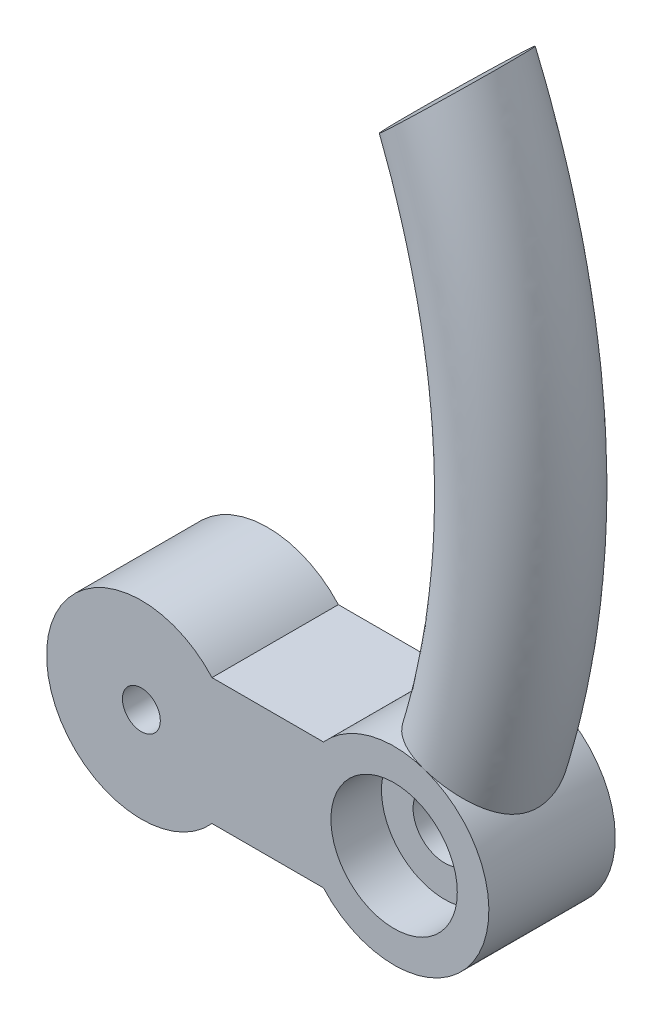
ISO-10303-21;
HEADER;
FILE_DESCRIPTION(('STEP AP214'),'2;1');
FILE_NAME('part.step','',(''),(''),'','','');
FILE_SCHEMA(('AUTOMOTIVE_DESIGN { 1 0 10303 214 1 1 1 1 }'));
ENDSEC;
DATA;
#1=APPLICATION_CONTEXT('core data for automotive mechanical design processes');
#2=APPLICATION_PROTOCOL_DEFINITION('international standard','automotive_design',2000,#1);
#3=PRODUCT_CONTEXT('',#1,'mechanical');
#4=PRODUCT('Part','Part','',(#3));
#5=PRODUCT_RELATED_PRODUCT_CATEGORY('part','',(#4));
#6=PRODUCT_DEFINITION_FORMATION('','',#4);
#7=PRODUCT_DEFINITION_CONTEXT('part definition',#1,'design');
#8=PRODUCT_DEFINITION('design','',#6,#7);
#9=PRODUCT_DEFINITION_SHAPE('','',#8);
#10=(LENGTH_UNIT() NAMED_UNIT(*) SI_UNIT(.MILLI.,.METRE.));
#11=(NAMED_UNIT(*) PLANE_ANGLE_UNIT() SI_UNIT($,.RADIAN.));
#12=(NAMED_UNIT(*) SI_UNIT($,.STERADIAN.) SOLID_ANGLE_UNIT());
#13=UNCERTAINTY_MEASURE_WITH_UNIT(LENGTH_MEASURE(1.E-05),#10,'distance_accuracy_value','');
#14=(GEOMETRIC_REPRESENTATION_CONTEXT(3) GLOBAL_UNCERTAINTY_ASSIGNED_CONTEXT((#13)) GLOBAL_UNIT_ASSIGNED_CONTEXT((#10,
#11,#12)) REPRESENTATION_CONTEXT('',''));
#15=CARTESIAN_POINT('',(0.,0.,0.));
#16=DIRECTION('',(0.,0.,1.));
#17=DIRECTION('',(1.,0.,0.));
#18=AXIS2_PLACEMENT_3D('',#15,#16,#17);
#19=CARTESIAN_POINT('',(10.,0.,5.));
#20=DIRECTION('',(0.,0.,-1.));
#21=DIRECTION('',(-1.,0.,0.));
#22=AXIS2_PLACEMENT_3D('',#19,#20,#21);
#23=CYLINDRICAL_SURFACE('',#22,2.5);
#24=CARTESIAN_POINT('',(10.,0.,1.));
#25=DIRECTION('',(0.,0.,1.));
#26=DIRECTION('',(1.,0.,0.));
#27=AXIS2_PLACEMENT_3D('',#24,#25,#26);
#28=CIRCLE('',#27,2.5);
#29=CARTESIAN_POINT('',(12.5,0.,1.));
#30=VERTEX_POINT('',#29);
#31=EDGE_CURVE('E98',#30,#30,#28,.T.);
#32=ORIENTED_EDGE('',*,*,#31,.T.);
#33=EDGE_LOOP('',(#32));
#34=FACE_BOUND('',#33,.T.);
#35=CARTESIAN_POINT('',(10.,0.,-5.));
#36=DIRECTION('',(0.,0.,1.));
#37=DIRECTION('',(1.,0.,0.));
#38=AXIS2_PLACEMENT_3D('',#35,#36,#37);
#39=CIRCLE('',#38,2.5);
#40=CARTESIAN_POINT('',(12.5,0.,-5.));
#41=VERTEX_POINT('',#40);
#42=EDGE_CURVE('E197',#41,#41,#39,.T.);
#43=ORIENTED_EDGE('',*,*,#42,.F.);
#44=EDGE_LOOP('',(#43));
#45=FACE_BOUND('',#44,.T.);
#46=ADVANCED_FACE('F35',(#34,#45),#23,.F.);
#47=CARTESIAN_POINT('',(10.,0.,5.));
#48=DIRECTION('',(0.,0.,-1.));
#49=DIRECTION('',(-1.,0.,0.));
#50=AXIS2_PLACEMENT_3D('',#47,#48,#49);
#51=CYLINDRICAL_SURFACE('',#50,7.5);
#52=CARTESIAN_POINT('',(10.,0.,5.));
#53=DIRECTION('',(0.,0.,1.));
#54=DIRECTION('',(1.,0.,0.));
#55=AXIS2_PLACEMENT_3D('',#52,#53,#54);
#56=CIRCLE('',#55,7.5);
#57=CARTESIAN_POINT('',(12.4349265316413,7.09373898487314,5.));
#58=VERTEX_POINT('',#57);
#59=CARTESIAN_POINT('',(4.40983005625052,5.,5.));
#60=VERTEX_POINT('',#59);
#61=EDGE_CURVE('E59',#58,#60,#56,.T.);
#62=ORIENTED_EDGE('',*,*,#61,.F.);
#63=CARTESIAN_POINT('',(12.4349265316413,7.09373898487314,5.));
#64=CARTESIAN_POINT('',(12.3317778963688,7.12914563765134,5.00000098680929));
#65=CARTESIAN_POINT('',(12.2278646702754,7.16229336303019,4.99586441202673));
#66=CARTESIAN_POINT('',(12.0193158731499,7.22386169777516,4.97931245522058));
#67=CARTESIAN_POINT('',(11.9146804416663,7.25228319513128,4.96689863057347));
#68=CARTESIAN_POINT('',(11.7065883444993,7.30403548695182,4.93408403200781));
#69=CARTESIAN_POINT('',(11.6031307098904,7.32741602792738,4.91376744019318));
#70=CARTESIAN_POINT('',(11.3970473377822,7.36948608393121,4.86536837955253));
#71=CARTESIAN_POINT('',(11.2944219167641,7.38817388852059,4.83728308695585));
#72=CARTESIAN_POINT('',(11.0906248659098,7.42099731905275,4.7736271704088));
#73=CARTESIAN_POINT('',(10.989455368368,7.4351268116804,4.73804656680214));
#74=CARTESIAN_POINT('',(10.7893451949434,7.45902870554867,4.6598149907221));
#75=CARTESIAN_POINT('',(10.6904054187591,7.46879937685718,4.61716122024123));
#76=CARTESIAN_POINT('',(10.3931743238323,7.49235869304758,4.47702474098137));
#77=CARTESIAN_POINT('',(10.1992714062767,7.49965096267358,4.36887784475125));
#78=CARTESIAN_POINT('',(9.82725839304931,7.50032557673154,4.12857820091443));
#79=CARTESIAN_POINT('',(9.64914912312472,7.49370719431229,3.9964241992322));
#80=CARTESIAN_POINT('',(9.28344452216033,7.46829134297541,3.68805037676362));
#81=CARTESIAN_POINT('',(9.09906534483846,7.44767831394053,3.5081584679261));
#82=CARTESIAN_POINT('',(8.75806277512366,7.39846934315223,3.12456933600828));
#83=CARTESIAN_POINT('',(8.6014729083037,7.36986386477454,2.92084384445084));
#84=CARTESIAN_POINT('',(8.29792271502172,7.30619597797985,2.46052888922173));
#85=CARTESIAN_POINT('',(8.15599034891167,7.27081094066926,2.20060264306369));
#86=CARTESIAN_POINT('',(7.97845258285973,7.22267908396678,1.79505423253641));
#87=CARTESIAN_POINT('',(7.92516122144771,7.20745742052265,1.65723880062476));
#88=CARTESIAN_POINT('',(7.831062683346,7.17970228711716,1.37709974967265));
#89=CARTESIAN_POINT('',(7.79025423658329,7.16716854371245,1.23477659089758));
#90=CARTESIAN_POINT('',(7.72301335989177,7.14608522998117,0.95153044134504));
#91=CARTESIAN_POINT('',(7.6961462172236,7.13741654933422,0.810719509299193));
#92=CARTESIAN_POINT('',(7.65529551523209,7.12410181442867,0.52704177001832));
#93=CARTESIAN_POINT('',(7.64131154642693,7.11945563231831,0.384175028272228));
#94=CARTESIAN_POINT('',(7.62653640252817,7.1145436990205,0.097781695334699));
#95=CARTESIAN_POINT('',(7.62573623132552,7.11427496083754,-0.0457443790559346));
#96=CARTESIAN_POINT('',(7.63732435186421,7.11813189745734,-0.332195481432792));
#97=CARTESIAN_POINT('',(7.6497116997383,7.12225725776231,-0.475120551699542));
#98=CARTESIAN_POINT('',(7.68514359763364,7.13384434964348,-0.742077679641409));
#99=CARTESIAN_POINT('',(7.70673710062002,7.14084827785249,-0.866325754691601));
#100=CARTESIAN_POINT('',(7.7596029767183,7.15761065001372,-1.11259266553468));
#101=CARTESIAN_POINT('',(7.79087854168982,7.16737000224577,-1.234610752104));
#102=CARTESIAN_POINT('',(7.86268603765668,7.18910934102857,-1.47569272323675));
#103=CARTESIAN_POINT('',(7.90321829912826,7.20108940685885,-1.59475650215922));
#104=CARTESIAN_POINT('',(7.99306402323044,7.22664434526931,-1.82935517155476));
#105=CARTESIAN_POINT('',(8.0423810382321,7.24021986225824,-1.94488861220748));
#106=CARTESIAN_POINT('',(8.20984708951506,7.28417763443192,-2.30034331800013));
#107=CARTESIAN_POINT('',(8.34281234303576,7.31621983277671,-2.53332681813883));
#108=CARTESIAN_POINT('',(8.56733136111166,7.36228898937003,-2.8658368413514));
#109=CARTESIAN_POINT('',(8.646425561724,7.37732465474199,-2.97392854050432));
#110=CARTESIAN_POINT('',(8.81255879403477,7.40588336996587,-3.18403777436348));
#111=CARTESIAN_POINT('',(8.89959873811427,7.41940624571187,-3.28605460928713));
#112=CARTESIAN_POINT('',(9.19330901998269,7.45929040818104,-3.60528620032513));
#113=CARTESIAN_POINT('',(9.4152855551343,7.48095037116863,-3.80962839217299));
#114=CARTESIAN_POINT('',(9.7718713492736,7.49747811675257,-4.08555198042914));
#115=CARTESIAN_POINT('',(9.89464923880205,7.50032779392262,-4.17241712444949));
#116=CARTESIAN_POINT('',(10.1473875853727,7.49961330394543,-4.33503714223072));
#117=CARTESIAN_POINT('',(10.2773452549728,7.49605160919043,-4.41079628657185));
#118=CARTESIAN_POINT('',(10.5092984346633,7.48334550947216,-4.53221537923103));
#119=CARTESIAN_POINT('',(10.6099601035044,7.47585893657875,-4.58062132668945));
#120=CARTESIAN_POINT('',(10.8140521355954,7.45639438123575,-4.67012760351928));
#121=CARTESIAN_POINT('',(10.9174818473642,7.44441744714447,-4.71122963482679));
#122=CARTESIAN_POINT('',(11.126383576021,7.41568397028855,-4.78564665949512));
#123=CARTESIAN_POINT('',(11.2318541581707,7.39893067912012,-4.81896692246576));
#124=CARTESIAN_POINT('',(11.4441494088197,7.36043939244542,-4.87745499068337));
#125=CARTESIAN_POINT('',(11.5509741121938,7.33870126830952,-4.90262258551682));
#126=CARTESIAN_POINT('',(11.7655533226274,7.29005964797167,-4.94457229465953));
#127=CARTESIAN_POINT('',(11.8733098313271,7.26313632658783,-4.96132130412687));
#128=CARTESIAN_POINT('',(12.0884430479151,7.2042239759634,-4.98609141324855));
#129=CARTESIAN_POINT('',(12.195819756352,7.1722349540417,-4.9941125255128));
#130=CARTESIAN_POINT('',(12.4093004832417,7.10336897640207,-5.00137448020193));
#131=CARTESIAN_POINT('',(12.5154044332481,7.06649175908071,-5.00061485251688));
#132=CARTESIAN_POINT('',(12.7254754105862,6.98815795062078,-4.99040857802072));
#133=CARTESIAN_POINT('',(12.8294424996984,6.94670149209797,-4.98096218272217));
#134=CARTESIAN_POINT('',(13.0283360692809,6.86222586832962,-4.95442875294238));
#135=CARTESIAN_POINT('',(13.1234312993242,6.81944857255555,-4.93783263752232));
#136=CARTESIAN_POINT('',(13.3105253568169,6.73061422289876,-4.89744640646084));
#137=CARTESIAN_POINT('',(13.4025231155855,6.68455605379355,-4.87365383561957));
#138=CARTESIAN_POINT('',(13.6731114972175,6.5421462876278,-4.79198102496482));
#139=CARTESIAN_POINT('',(13.8464403403268,6.44149799499257,-4.72378587892657));
#140=CARTESIAN_POINT('',(14.1893249124643,6.22446940647486,-4.55670900485077));
#141=CARTESIAN_POINT('',(14.3574978124181,6.10747444570931,-4.45582672234746));
#142=CARTESIAN_POINT('',(14.6731589676551,5.86947166535845,-4.2295297935602));
#143=CARTESIAN_POINT('',(14.8206386150957,5.74846220157312,-4.1041049898818));
#144=CARTESIAN_POINT('',(15.1191501256542,5.48548870105786,-3.80770709532122));
#145=CARTESIAN_POINT('',(15.2661546570681,5.34362288851883,-3.63260061843145));
#146=CARTESIAN_POINT('',(15.5322137718051,5.06768055139388,-3.25632280042235));
#147=CARTESIAN_POINT('',(15.651224858675,4.93361638914295,-3.05511164042766));
#148=CARTESIAN_POINT('',(15.8171141238895,4.73499291242648,-2.72003709015011));
#149=CARTESIAN_POINT('',(15.8731837044403,4.66506139899429,-2.59378262111564));
#150=CARTESIAN_POINT('',(15.9763522542466,4.53213912961981,-2.33406859513803));
#151=CARTESIAN_POINT('',(16.0234495916377,4.46914963716324,-2.20060773315624));
#152=CARTESIAN_POINT('',(16.1085974977279,4.3520426527192,-1.92733869123475));
#153=CARTESIAN_POINT('',(16.1466628682438,4.29791069062214,-1.7875413499087));
#154=CARTESIAN_POINT('',(16.2137853257329,4.20028443786103,-1.50219893042241));
#155=CARTESIAN_POINT('',(16.2428460540991,4.15678584866657,-1.35665620255696));
#156=CARTESIAN_POINT('',(16.2858874372761,4.09130227026317,-1.09695793788369));
#157=CARTESIAN_POINT('',(16.3018170143885,4.06665784855413,-0.983789191283092));
#158=CARTESIAN_POINT('',(16.3284079992512,4.02515382205104,-0.755430675234384));
#159=CARTESIAN_POINT('',(16.3390705360881,4.00829254884738,-0.640241344422812));
#160=CARTESIAN_POINT('',(16.3550735989555,3.98287161393357,-0.408682141254402));
#161=CARTESIAN_POINT('',(16.3604188051718,3.97430465194943,-0.29231339830014));
#162=CARTESIAN_POINT('',(16.3657752706186,3.96571955152868,-0.05913265058911));
#163=CARTESIAN_POINT('',(16.3657863950365,3.96570162915899,0.0576793652962453));
#164=CARTESIAN_POINT('',(16.360473674295,3.97421679911055,0.290881964953061));
#165=CARTESIAN_POINT('',(16.3551491593893,3.98275096491697,0.407272493977442));
#166=CARTESIAN_POINT('',(16.3391935582005,4.0080977366923,0.638773815842308));
#167=CARTESIAN_POINT('',(16.3285624268456,4.02491041297491,0.75388459780474));
#168=CARTESIAN_POINT('',(16.3020336923408,4.06632198215567,0.982145326115038));
#169=CARTESIAN_POINT('',(16.2861330626268,4.09092534931573,1.09529410618383));
#170=CARTESIAN_POINT('',(16.2491238474367,4.14723792893873,1.31895712875471));
#171=CARTESIAN_POINT('',(16.2280131330571,4.17895004563565,1.42947027401087));
#172=CARTESIAN_POINT('',(16.155687995092,4.28544196322094,1.76198964397616));
#173=CARTESIAN_POINT('',(16.0961619609967,4.37044266114733,1.97903047503992));
#174=CARTESIAN_POINT('',(15.9555842753328,4.56014593201688,2.39676442871497));
#175=CARTESIAN_POINT('',(15.8745187206832,4.66486121733584,2.59744688278668));
#176=CARTESIAN_POINT('',(15.6722508964742,4.90973652520259,3.01880585756089));
#177=CARTESIAN_POINT('',(15.5462731417343,5.05280435789534,3.2355249274641));
#178=CARTESIAN_POINT('',(15.2619680481482,5.34824954949672,3.6394044020338));
#179=CARTESIAN_POINT('',(15.1036397111783,5.50062719554253,3.82656389437245));
#180=CARTESIAN_POINT('',(14.770777011033,5.79080488959857,4.14990350239588));
#181=CARTESIAN_POINT('',(14.5993650086254,5.92856570229929,4.28928620911287));
#182=CARTESIAN_POINT('',(14.3223721011826,6.13027007257405,4.47367083165434));
#183=CARTESIAN_POINT('',(14.2266799045237,6.19671156811386,4.53103822812464));
#184=CARTESIAN_POINT('',(14.0288929138394,6.32708647659936,4.6368419581543));
#185=CARTESIAN_POINT('',(13.9268012404284,6.39102108764468,4.68528260000863));
#186=CARTESIAN_POINT('',(13.716076703262,6.51581497408457,4.77273419247333));
#187=CARTESIAN_POINT('',(13.6074139968484,6.57665748329362,4.81169734141867));
#188=CARTESIAN_POINT('',(13.3846932956662,6.69400322457248,4.87914571754643));
#189=CARTESIAN_POINT('',(13.270638420941,6.75050891755351,4.9076369223009));
#190=CARTESIAN_POINT('',(13.0381853459246,6.8582655589557,4.95348995348068));
#191=CARTESIAN_POINT('',(12.9197966060381,6.90952712277148,4.97087465220231));
#192=CARTESIAN_POINT('',(12.6796076586592,7.00617163434061,4.99412543225153));
#193=CARTESIAN_POINT('',(12.5578096662712,7.05155829611619,4.99999882439338));
#194=CARTESIAN_POINT('',(12.4349265316413,7.09373898487314,5.));
#195=B_SPLINE_CURVE_WITH_KNOTS('',3,(#63,#64,#65,#66,#67,#68,#69,#70,#71,#72,#73,#74,#75,#76,
#77,#78,#79,#80,#81,#82,#83,#84,#85,#86,#87,#88,#89,#90,#91,#92,#93,#94,#95,#96,#97,#98,#99,
#100,#101,#102,#103,#104,#105,#106,#107,#108,#109,#110,#111,#112,#113,#114,#115,#116,#117,#118,
#119,#120,#121,#122,#123,#124,#125,#126,#127,#128,#129,#130,#131,#132,#133,#134,#135,#136,#137,
#138,#139,#140,#141,#142,#143,#144,#145,#146,#147,#148,#149,#150,#151,#152,#153,#154,#155,#156,
#157,#158,#159,#160,#161,#162,#163,#164,#165,#166,#167,#168,#169,#170,#171,#172,#173,#174,#175,
#176,#177,#178,#179,#180,#181,#182,#183,#184,#185,#186,#187,#188,#189,#190,#191,#192,#193,#194),
.UNSPECIFIED.,.T.,.F.,(4,2,2,2,2,2,2,2,2,2,2,2,2,2,2,2,2,2,2,2,2,2,2,2,2,2,2,2,2,2,2,2,2,2,2,2,
2,2,2,2,2,2,2,2,2,2,2,2,2,2,2,2,2,2,2,2,2,2,2,2,2,2,2,2,2,4),(0.,0.327046116207848,
0.654030715575338,0.977623592438495,1.30133424388701,1.62547865634847,1.9497516012736,
2.61339027736956,3.27706363038542,4.04932735252893,4.82251650736526,5.71250468136559,
6.15763808016381,6.60272617382905,7.03294534327763,7.46315083806774,7.89306276524773,
8.32294392450952,8.70143481026504,9.08005060521917,9.45867991936907,9.8374626923429,
10.6441906260496,11.0482251215802,11.452306069431,12.3540746535529,12.8048191447997,
13.2553898544486,13.5909041911994,13.9263402446204,14.2615484865986,14.5967653793313,
14.9332903471695,15.2698148288019,15.6063573276213,15.9428900826552,16.2592894247472,
16.5757968341405,17.2083459575065,17.8909274881619,18.573792118114,19.3780234921301,
20.1834963526006,20.6475155050281,21.1116189724865,21.5749565193614,22.0381064515977,
22.3884791944535,22.738776795864,23.0887658002768,23.4387636502491,23.7888054385629,
24.1388502000158,24.4890963609692,24.8394858743752,25.5583425845343,26.2776644259788,
27.1399996186292,28.0023614212238,28.7799640070457,29.1691245652458,29.5580968092337,
29.9489920232699,30.3396637595551,30.729528346345,31.1191452503588),.UNSPECIFIED.);
#196=CARTESIAN_POINT('',(12.4349265284973,7.09373898595351,-5.));
#197=VERTEX_POINT('',#196);
#198=EDGE_CURVE('E50',#58,#197,#195,.T.);
#199=ORIENTED_EDGE('',*,*,#198,.T.);
#200=CARTESIAN_POINT('',(10.,0.,-5.));
#201=DIRECTION('',(0.,0.,1.));
#202=DIRECTION('',(1.,0.,0.));
#203=AXIS2_PLACEMENT_3D('',#200,#201,#202);
#204=CIRCLE('',#203,7.5);
#205=CARTESIAN_POINT('',(4.40983005625052,5.,-5.));
#206=VERTEX_POINT('',#205);
#207=EDGE_CURVE('E80',#197,#206,#204,.T.);
#208=ORIENTED_EDGE('',*,*,#207,.T.);
#209=DIRECTION('',(0.,0.,-1.));
#210=VECTOR('',#209,1.);
#211=CARTESIAN_POINT('',(4.40983005625052,5.,5.));
#212=LINE('',#211,#210);
#213=EDGE_CURVE('E189',#60,#206,#212,.T.);
#214=ORIENTED_EDGE('',*,*,#213,.F.);
#215=EDGE_LOOP('',(#62,#199,#208,#214));
#216=FACE_BOUND('',#215,.T.);
#217=ADVANCED_FACE('F151',(#216),#51,.T.);
#218=CARTESIAN_POINT('',(-10.,0.,5.));
#219=DIRECTION('',(0.,0.,-1.));
#220=DIRECTION('',(-1.,0.,0.));
#221=AXIS2_PLACEMENT_3D('',#218,#219,#220);
#222=CYLINDRICAL_SURFACE('',#221,1.5);
#223=CARTESIAN_POINT('',(-10.,0.,5.));
#224=DIRECTION('',(0.,0.,1.));
#225=DIRECTION('',(1.,0.,0.));
#226=AXIS2_PLACEMENT_3D('',#223,#224,#225);
#227=CIRCLE('',#226,1.5);
#228=CARTESIAN_POINT('',(-8.5,0.,5.));
#229=VERTEX_POINT('',#228);
#230=EDGE_CURVE('E188',#229,#229,#227,.T.);
#231=ORIENTED_EDGE('',*,*,#230,.T.);
#232=EDGE_LOOP('',(#231));
#233=FACE_BOUND('',#232,.T.);
#234=CARTESIAN_POINT('',(-10.,0.,-1.));
#235=DIRECTION('',(0.,0.,-1.));
#236=DIRECTION('',(-1.,0.,0.));
#237=AXIS2_PLACEMENT_3D('',#234,#235,#236);
#238=CIRCLE('',#237,1.5);
#239=CARTESIAN_POINT('',(-11.5,0.,-1.));
#240=VERTEX_POINT('',#239);
#241=EDGE_CURVE('E39',#240,#240,#238,.T.);
#242=ORIENTED_EDGE('',*,*,#241,.T.);
#243=EDGE_LOOP('',(#242));
#244=FACE_BOUND('',#243,.T.);
#245=ADVANCED_FACE('F37',(#233,#244),#222,.F.);
#246=CARTESIAN_POINT('',(0.,5.,5.));
#247=DIRECTION('',(0.,-1.,0.));
#248=DIRECTION('',(1.,0.,0.));
#249=AXIS2_PLACEMENT_3D('',#246,#247,#248);
#250=PLANE('',#249);
#251=DIRECTION('',(-1.,0.,0.));
#252=VECTOR('',#251,1.);
#253=CARTESIAN_POINT('',(0.,5.,-5.));
#254=LINE('',#253,#252);
#255=CARTESIAN_POINT('',(-4.40983005625053,5.,-5.));
#256=VERTEX_POINT('',#255);
#257=EDGE_CURVE('E183',#206,#256,#254,.T.);
#258=ORIENTED_EDGE('',*,*,#257,.T.);
#259=DIRECTION('',(0.,0.,-1.));
#260=VECTOR('',#259,1.);
#261=CARTESIAN_POINT('',(-4.40983005625053,5.,5.));
#262=LINE('',#261,#260);
#263=CARTESIAN_POINT('',(-4.40983005625053,5.,5.));
#264=VERTEX_POINT('',#263);
#265=EDGE_CURVE('E11',#264,#256,#262,.T.);
#266=ORIENTED_EDGE('',*,*,#265,.F.);
#267=DIRECTION('',(-1.,0.,0.));
#268=VECTOR('',#267,1.);
#269=CARTESIAN_POINT('',(0.,5.,5.));
#270=LINE('',#269,#268);
#271=EDGE_CURVE('E205',#60,#264,#270,.T.);
#272=ORIENTED_EDGE('',*,*,#271,.F.);
#273=ORIENTED_EDGE('',*,*,#213,.T.);
#274=EDGE_LOOP('',(#258,#266,#272,#273));
#275=FACE_BOUND('',#274,.T.);
#276=ADVANCED_FACE('F158',(#275),#250,.F.);
#277=CARTESIAN_POINT('',(-10.,0.,5.));
#278=DIRECTION('',(0.,0.,-1.));
#279=DIRECTION('',(-1.,0.,0.));
#280=AXIS2_PLACEMENT_3D('',#277,#278,#279);
#281=CYLINDRICAL_SURFACE('',#280,7.5);
#282=CARTESIAN_POINT('',(-10.,0.,-5.));
#283=DIRECTION('',(0.,0.,1.));
#284=DIRECTION('',(1.,0.,0.));
#285=AXIS2_PLACEMENT_3D('',#282,#283,#284);
#286=CIRCLE('',#285,7.5);
#287=CARTESIAN_POINT('',(-4.40983005625053,-5.,-5.));
#288=VERTEX_POINT('',#287);
#289=EDGE_CURVE('E179',#256,#288,#286,.T.);
#290=ORIENTED_EDGE('',*,*,#289,.T.);
#291=DIRECTION('',(0.,0.,-1.));
#292=VECTOR('',#291,1.);
#293=CARTESIAN_POINT('',(-4.40983005625053,-5.,5.));
#294=LINE('',#293,#292);
#295=CARTESIAN_POINT('',(-4.40983005625053,-5.,5.));
#296=VERTEX_POINT('',#295);
#297=EDGE_CURVE('E44',#296,#288,#294,.T.);
#298=ORIENTED_EDGE('',*,*,#297,.F.);
#299=CARTESIAN_POINT('',(-10.,0.,5.));
#300=DIRECTION('',(0.,0.,1.));
#301=DIRECTION('',(1.,0.,0.));
#302=AXIS2_PLACEMENT_3D('',#299,#300,#301);
#303=CIRCLE('',#302,7.5);
#304=EDGE_CURVE('E87',#264,#296,#303,.T.);
#305=ORIENTED_EDGE('',*,*,#304,.F.);
#306=ORIENTED_EDGE('',*,*,#265,.T.);
#307=EDGE_LOOP('',(#290,#298,#305,#306));
#308=FACE_BOUND('',#307,.T.);
#309=ADVANCED_FACE('F161',(#308),#281,.T.);
#310=CARTESIAN_POINT('',(0.,-5.,5.));
#311=DIRECTION('',(0.,-1.,0.));
#312=DIRECTION('',(1.,0.,0.));
#313=AXIS2_PLACEMENT_3D('',#310,#311,#312);
#314=PLANE('',#313);
#315=DIRECTION('',(-1.,0.,0.));
#316=VECTOR('',#315,1.);
#317=CARTESIAN_POINT('',(0.,-5.,-5.));
#318=LINE('',#317,#316);
#319=CARTESIAN_POINT('',(4.40983005625053,-5.,-5.));
#320=VERTEX_POINT('',#319);
#321=EDGE_CURVE('E173',#320,#288,#318,.T.);
#322=ORIENTED_EDGE('',*,*,#321,.F.);
#323=DIRECTION('',(0.,0.,-1.));
#324=VECTOR('',#323,1.);
#325=CARTESIAN_POINT('',(4.40983005625053,-5.,5.));
#326=LINE('',#325,#324);
#327=CARTESIAN_POINT('',(4.40983005625053,-5.,5.));
#328=VERTEX_POINT('',#327);
#329=EDGE_CURVE('E175',#328,#320,#326,.T.);
#330=ORIENTED_EDGE('',*,*,#329,.F.);
#331=DIRECTION('',(-1.,0.,0.));
#332=VECTOR('',#331,1.);
#333=CARTESIAN_POINT('',(0.,-5.,5.));
#334=LINE('',#333,#332);
#335=EDGE_CURVE('E202',#328,#296,#334,.T.);
#336=ORIENTED_EDGE('',*,*,#335,.T.);
#337=ORIENTED_EDGE('',*,*,#297,.T.);
#338=EDGE_LOOP('',(#322,#330,#336,#337));
#339=FACE_BOUND('',#338,.T.);
#340=ADVANCED_FACE('F164',(#339),#314,.T.);
#341=EDGE_CURVE('E181',#320,#197,#204,.T.);
#342=ORIENTED_EDGE('',*,*,#341,.T.);
#343=EDGE_CURVE('E97',#197,#58,#195,.T.);
#344=ORIENTED_EDGE('',*,*,#343,.T.);
#345=EDGE_CURVE('E191',#328,#58,#56,.T.);
#346=ORIENTED_EDGE('',*,*,#345,.F.);
#347=ORIENTED_EDGE('',*,*,#329,.T.);
#348=EDGE_LOOP('',(#342,#344,#346,#347));
#349=FACE_BOUND('',#348,.T.);
#350=ADVANCED_FACE('F113',(#349),#51,.T.);
#351=CARTESIAN_POINT('',(0.,0.,5.));
#352=DIRECTION('',(0.,0.,1.));
#353=DIRECTION('',(1.,0.,0.));
#354=AXIS2_PLACEMENT_3D('',#351,#352,#353);
#355=PLANE('',#354);
#356=CARTESIAN_POINT('',(10.,0.,5.));
#357=DIRECTION('',(0.,0.,1.));
#358=DIRECTION('',(1.,0.,0.));
#359=AXIS2_PLACEMENT_3D('',#356,#357,#358);
#360=CIRCLE('',#359,5.);
#361=CARTESIAN_POINT('',(15.,0.,5.));
#362=VERTEX_POINT('',#361);
#363=EDGE_CURVE('E314',#362,#362,#360,.T.);
#364=ORIENTED_EDGE('',*,*,#363,.F.);
#365=EDGE_LOOP('',(#364));
#366=FACE_BOUND('',#365,.T.);
#367=ORIENTED_EDGE('',*,*,#345,.T.);
#368=ORIENTED_EDGE('',*,*,#61,.T.);
#369=ORIENTED_EDGE('',*,*,#271,.T.);
#370=ORIENTED_EDGE('',*,*,#304,.T.);
#371=ORIENTED_EDGE('',*,*,#335,.F.);
#372=EDGE_LOOP('',(#367,#368,#369,#370,#371));
#373=FACE_BOUND('',#372,.T.);
#374=ORIENTED_EDGE('',*,*,#230,.F.);
#375=EDGE_LOOP('',(#374));
#376=FACE_BOUND('',#375,.T.);
#377=ADVANCED_FACE('F142',(#366,#373,#376),#355,.T.);
#378=CARTESIAN_POINT('',(0.,0.,-5.));
#379=DIRECTION('',(0.,0.,1.));
#380=DIRECTION('',(1.,0.,0.));
#381=AXIS2_PLACEMENT_3D('',#378,#379,#380);
#382=PLANE('',#381);
#383=ORIENTED_EDGE('',*,*,#207,.F.);
#384=ORIENTED_EDGE('',*,*,#341,.F.);
#385=ORIENTED_EDGE('',*,*,#321,.T.);
#386=ORIENTED_EDGE('',*,*,#289,.F.);
#387=ORIENTED_EDGE('',*,*,#257,.F.);
#388=EDGE_LOOP('',(#383,#384,#385,#386,#387));
#389=FACE_BOUND('',#388,.T.);
#390=CARTESIAN_POINT('',(-10.,0.,-5.));
#391=DIRECTION('',(0.,0.,-1.));
#392=DIRECTION('',(-1.,0.,0.));
#393=AXIS2_PLACEMENT_3D('',#390,#391,#392);
#394=CIRCLE('',#393,5.);
#395=CARTESIAN_POINT('',(-15.,0.,-5.));
#396=VERTEX_POINT('',#395);
#397=EDGE_CURVE('E208',#396,#396,#394,.T.);
#398=ORIENTED_EDGE('',*,*,#397,.F.);
#399=EDGE_LOOP('',(#398));
#400=FACE_BOUND('',#399,.T.);
#401=ORIENTED_EDGE('',*,*,#42,.T.);
#402=EDGE_LOOP('',(#401));
#403=FACE_BOUND('',#402,.T.);
#404=ADVANCED_FACE('F140',(#389,#400,#403),#382,.F.);
#405=CARTESIAN_POINT('',(-10.,0.,-1.));
#406=DIRECTION('',(0.,0.,-1.));
#407=DIRECTION('',(-1.,0.,0.));
#408=AXIS2_PLACEMENT_3D('',#405,#406,#407);
#409=CYLINDRICAL_SURFACE('',#408,5.);
#410=CARTESIAN_POINT('',(-10.,0.,-1.));
#411=DIRECTION('',(0.,0.,-1.));
#412=DIRECTION('',(-1.,0.,0.));
#413=AXIS2_PLACEMENT_3D('',#410,#411,#412);
#414=CIRCLE('',#413,5.);
#415=CARTESIAN_POINT('',(-15.,0.,-1.));
#416=VERTEX_POINT('',#415);
#417=EDGE_CURVE('E111',#416,#416,#414,.T.);
#418=ORIENTED_EDGE('',*,*,#417,.F.);
#419=EDGE_LOOP('',(#418));
#420=FACE_BOUND('',#419,.T.);
#421=ORIENTED_EDGE('',*,*,#397,.T.);
#422=EDGE_LOOP('',(#421));
#423=FACE_BOUND('',#422,.T.);
#424=ADVANCED_FACE('F136',(#420,#423),#409,.F.);
#425=CARTESIAN_POINT('',(-10.,0.,-1.));
#426=DIRECTION('',(0.,0.,-1.));
#427=DIRECTION('',(-1.,0.,0.));
#428=AXIS2_PLACEMENT_3D('',#425,#426,#427);
#429=PLANE('',#428);
#430=ORIENTED_EDGE('',*,*,#241,.F.);
#431=EDGE_LOOP('',(#430));
#432=FACE_BOUND('',#431,.T.);
#433=ORIENTED_EDGE('',*,*,#417,.T.);
#434=EDGE_LOOP('',(#433));
#435=FACE_BOUND('',#434,.T.);
#436=ADVANCED_FACE('F133',(#432,#435),#429,.T.);
#437=CARTESIAN_POINT('',(10.,50.,0.));
#438=DIRECTION('',(-0.689655172413793,0.724137931034483,0.));
#439=DIRECTION('',(0.,0.,1.));
#440=AXIS2_PLACEMENT_3D('',#437,#438,#439);
#441=PLANE('',#440);
#442=CARTESIAN_POINT('',(10.,50.,0.));
#443=DIRECTION('',(-0.689655172413793,0.724137931034483,0.));
#444=DIRECTION('',(0.,0.,1.));
#445=AXIS2_PLACEMENT_3D('',#442,#443,#444);
#446=CIRCLE('',#445,5.);
#447=CARTESIAN_POINT('',(10.,50.,5.));
#448=VERTEX_POINT('',#447);
#449=EDGE_CURVE('E94',#448,#448,#446,.T.);
#450=ORIENTED_EDGE('',*,*,#449,.T.);
#451=EDGE_LOOP('',(#450));
#452=FACE_BOUND('',#451,.T.);
#453=ADVANCED_FACE('F95',(#452),#441,.T.);
#454=CARTESIAN_POINT('',(10.,0.,5.));
#455=CARTESIAN_POINT('',(13.3333333332778,8.33333333333021,5.));
#456=CARTESIAN_POINT('',(15.,16.6666666666667,5.));
#457=CARTESIAN_POINT('',(15.,33.3333333333333,5.));
#458=CARTESIAN_POINT('',(13.3333333333034,41.6666666667414,5.));
#459=CARTESIAN_POINT('',(10.,50.,5.));
#460=CARTESIAN_POINT('',(20.,0.,5.));
#461=CARTESIAN_POINT('',(23.333333333418,9.48275862078508,5.));
#462=CARTESIAN_POINT('',(24.779954477258,19.1426045092068,5.));
#463=CARTESIAN_POINT('',(23.7895793404472,38.2852090178753,5.));
#464=CARTESIAN_POINT('',(21.3674197385729,47.7308759414694,5.));
#465=CARTESIAN_POINT('',(17.2413793103448,56.8965517241379,5.));
#466=CARTESIAN_POINT('',(20.,0.,-5.));
#467=CARTESIAN_POINT('',(23.333333333418,9.48275862078508,-5.));
#468=CARTESIAN_POINT('',(24.779954477258,19.1426045092068,-5.));
#469=CARTESIAN_POINT('',(23.7895793404472,38.2852090178753,-5.));
#470=CARTESIAN_POINT('',(21.3674197385729,47.7308759414694,-5.));
#471=CARTESIAN_POINT('',(17.2413793103448,56.8965517241379,-5.));
#472=CARTESIAN_POINT('',(10.,0.,-5.));
#473=CARTESIAN_POINT('',(13.3333333332778,8.33333333333021,-5.));
#474=CARTESIAN_POINT('',(15.,16.6666666666667,-5.));
#475=CARTESIAN_POINT('',(15.,33.3333333333333,-5.));
#476=CARTESIAN_POINT('',(13.3333333333034,41.6666666667414,-5.));
#477=CARTESIAN_POINT('',(10.,50.,-5.));
#478=CARTESIAN_POINT('',(0.,0.,-5.));
#479=CARTESIAN_POINT('',(3.33333333313772,7.18390804587534,-5.));
#480=CARTESIAN_POINT('',(5.22004552274197,14.1907288241266,-5.));
#481=CARTESIAN_POINT('',(6.21042065955284,28.3814576487914,-5.));
#482=CARTESIAN_POINT('',(5.29924692803394,35.6024573920134,-5.));
#483=CARTESIAN_POINT('',(2.75862068965518,43.1034482758621,-5.));
#484=CARTESIAN_POINT('',(0.,0.,5.));
#485=CARTESIAN_POINT('',(3.33333333313772,7.18390804587534,5.));
#486=CARTESIAN_POINT('',(5.22004552274197,14.1907288241266,5.));
#487=CARTESIAN_POINT('',(6.21042065955284,28.3814576487914,5.));
#488=CARTESIAN_POINT('',(5.29924692803394,35.6024573920134,5.));
#489=CARTESIAN_POINT('',(2.75862068965518,43.1034482758621,5.));
#490=CARTESIAN_POINT('',(10.,0.,5.));
#491=CARTESIAN_POINT('',(13.3333333332778,8.33333333333021,5.));
#492=CARTESIAN_POINT('',(15.,16.6666666666667,5.));
#493=CARTESIAN_POINT('',(15.,33.3333333333333,5.));
#494=CARTESIAN_POINT('',(13.3333333333034,41.6666666667414,5.));
#495=CARTESIAN_POINT('',(10.,50.,5.));
#496=(BOUNDED_SURFACE() B_SPLINE_SURFACE(3,3,((#454,#455,#456,#457,#458,#459),(#460,#461,#462,
#463,#464,#465),(#466,#467,#468,#469,#470,#471),(#472,#473,#474,#475,#476,#477),(#478,#479,#480,
#481,#482,#483),(#484,#485,#486,#487,#488,#489),(#490,#491,#492,#493,#494,#495)),.UNSPECIFIED.,
.T.,.F.,.F.) B_SPLINE_SURFACE_WITH_KNOTS((4,3,4),(4,2,4),(0.,0.5,1.),(0.,0.5,1.),
.UNSPECIFIED.) GEOMETRIC_REPRESENTATION_ITEM() RATIONAL_B_SPLINE_SURFACE(((1.,1.,1.,1.,1.,1.),
(0.333333333333333,0.333333333333333,0.333333333333333,0.333333333333333,0.333333333333333,
0.333333333333333),(0.333333333333333,0.333333333333333,0.333333333333333,0.333333333333333,
0.333333333333333,0.333333333333333),(1.,1.,1.,1.,1.,1.),(0.333333333333333,0.333333333333333,
0.333333333333333,0.333333333333333,0.333333333333333,0.333333333333333),(0.333333333333333,
0.333333333333333,0.333333333333333,0.333333333333333,0.333333333333333,0.333333333333333),(1.,
1.,1.,1.,1.,1.))) REPRESENTATION_ITEM('') SURFACE());
#497=ORIENTED_EDGE('',*,*,#449,.F.);
#498=EDGE_LOOP('',(#497));
#499=FACE_BOUND('',#498,.T.);
#500=ORIENTED_EDGE('',*,*,#198,.F.);
#501=ORIENTED_EDGE('',*,*,#343,.F.);
#502=EDGE_LOOP('',(#500,#501));
#503=FACE_BOUND('',#502,.T.);
#504=ADVANCED_FACE('F117',(#499,#503),#496,.T.);
#505=CARTESIAN_POINT('',(10.,0.,1.));
#506=DIRECTION('',(0.,0.,1.));
#507=DIRECTION('',(1.,0.,0.));
#508=AXIS2_PLACEMENT_3D('',#505,#506,#507);
#509=CYLINDRICAL_SURFACE('',#508,5.);
#510=CARTESIAN_POINT('',(10.,0.,1.));
#511=DIRECTION('',(0.,0.,1.));
#512=DIRECTION('',(1.,0.,0.));
#513=AXIS2_PLACEMENT_3D('',#510,#511,#512);
#514=CIRCLE('',#513,5.);
#515=CARTESIAN_POINT('',(15.,0.,1.));
#516=VERTEX_POINT('',#515);
#517=EDGE_CURVE('E102',#516,#516,#514,.T.);
#518=ORIENTED_EDGE('',*,*,#517,.F.);
#519=EDGE_LOOP('',(#518));
#520=FACE_BOUND('',#519,.T.);
#521=ORIENTED_EDGE('',*,*,#363,.T.);
#522=EDGE_LOOP('',(#521));
#523=FACE_BOUND('',#522,.T.);
#524=ADVANCED_FACE('F124',(#520,#523),#509,.F.);
#525=CARTESIAN_POINT('',(10.,0.,1.));
#526=DIRECTION('',(0.,0.,1.));
#527=DIRECTION('',(1.,0.,0.));
#528=AXIS2_PLACEMENT_3D('',#525,#526,#527);
#529=PLANE('',#528);
#530=ORIENTED_EDGE('',*,*,#31,.F.);
#531=EDGE_LOOP('',(#530));
#532=FACE_BOUND('',#531,.T.);
#533=ORIENTED_EDGE('',*,*,#517,.T.);
#534=EDGE_LOOP('',(#533));
#535=FACE_BOUND('',#534,.T.);
#536=ADVANCED_FACE('F296',(#532,#535),#529,.T.);
#537=CLOSED_SHELL('',(#46,#217,#245,#276,#309,#340,#350,#377,#404,#424,#436,#453,#504,#524,#536));
#538=MANIFOLD_SOLID_BREP('B2',#537);
#539=ADVANCED_BREP_SHAPE_REPRESENTATION('',(#18,#538),#14);
#540=SHAPE_DEFINITION_REPRESENTATION(#9,#539);
ENDSEC;
END-ISO-10303-21;
